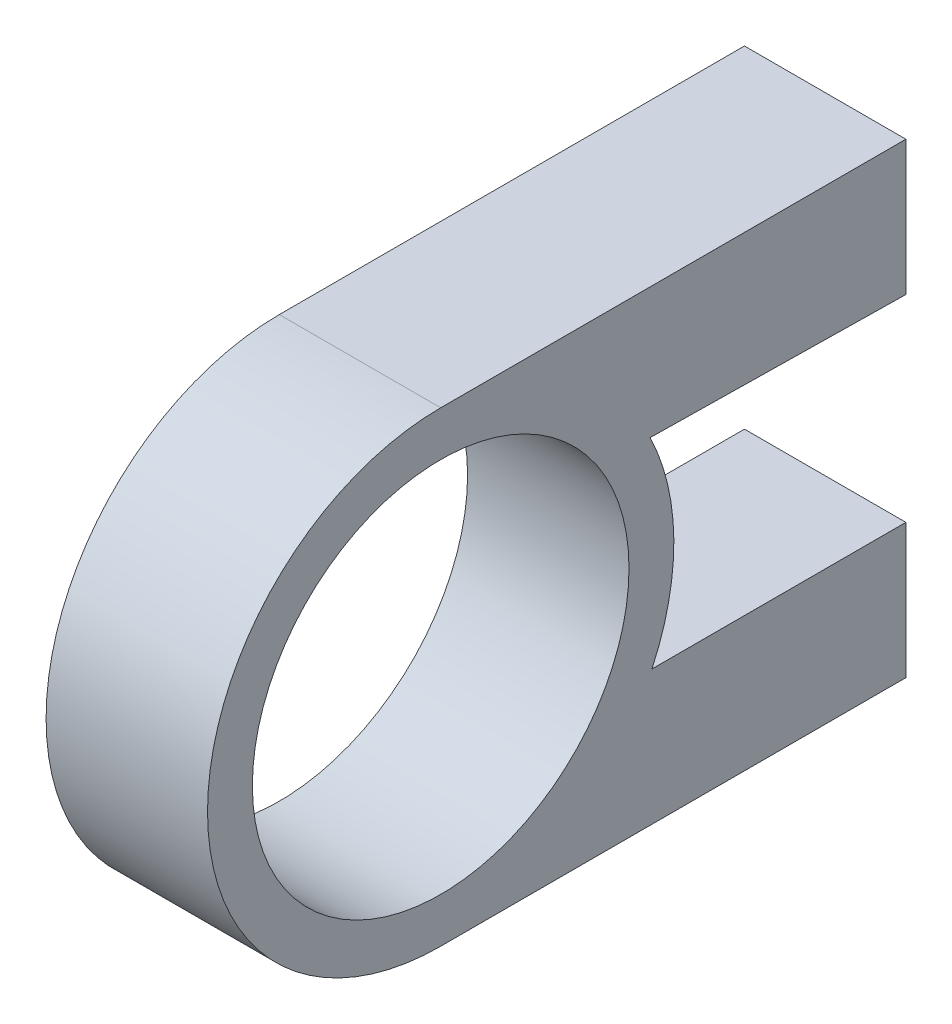
ISO-10303-21;
HEADER;
FILE_DESCRIPTION(('STEP AP214'),'2;1');
FILE_NAME('part.step','',(''),(''),'','','');
FILE_SCHEMA(('AUTOMOTIVE_DESIGN { 1 0 10303 214 1 1 1 1 }'));
ENDSEC;
DATA;
#1=APPLICATION_CONTEXT('core data for automotive mechanical design processes');
#2=APPLICATION_PROTOCOL_DEFINITION('international standard','automotive_design',2000,#1);
#3=PRODUCT_CONTEXT('',#1,'mechanical');
#4=PRODUCT('Part','Part','',(#3));
#5=PRODUCT_RELATED_PRODUCT_CATEGORY('part','',(#4));
#6=PRODUCT_DEFINITION_FORMATION('','',#4);
#7=PRODUCT_DEFINITION_CONTEXT('part definition',#1,'design');
#8=PRODUCT_DEFINITION('design','',#6,#7);
#9=PRODUCT_DEFINITION_SHAPE('','',#8);
#10=(LENGTH_UNIT() NAMED_UNIT(*) SI_UNIT(.MILLI.,.METRE.));
#11=(NAMED_UNIT(*) PLANE_ANGLE_UNIT() SI_UNIT($,.RADIAN.));
#12=(NAMED_UNIT(*) SI_UNIT($,.STERADIAN.) SOLID_ANGLE_UNIT());
#13=UNCERTAINTY_MEASURE_WITH_UNIT(LENGTH_MEASURE(1.E-05),#10,'distance_accuracy_value','');
#14=(GEOMETRIC_REPRESENTATION_CONTEXT(3) GLOBAL_UNCERTAINTY_ASSIGNED_CONTEXT((#13)) GLOBAL_UNIT_ASSIGNED_CONTEXT((#10,
#11,#12)) REPRESENTATION_CONTEXT('',''));
#15=CARTESIAN_POINT('',(0.,0.,0.));
#16=DIRECTION('',(0.,0.,1.));
#17=DIRECTION('',(1.,0.,0.));
#18=AXIS2_PLACEMENT_3D('',#15,#16,#17);
#19=CARTESIAN_POINT('',(1.8,2.6,0.));
#20=DIRECTION('',(0.,1.,0.));
#21=DIRECTION('',(0.,0.,1.));
#22=AXIS2_PLACEMENT_3D('',#19,#20,#21);
#23=PLANE('',#22);
#24=DIRECTION('',(0.,0.,-1.));
#25=VECTOR('',#24,1.);
#26=CARTESIAN_POINT('',(0.,2.6,0.));
#27=LINE('',#26,#25);
#28=CARTESIAN_POINT('',(0.,2.6,0.));
#29=VERTEX_POINT('',#28);
#30=CARTESIAN_POINT('',(0.,2.6,-5.1875));
#31=VERTEX_POINT('',#30);
#32=EDGE_CURVE('E173',#29,#31,#27,.T.);
#33=ORIENTED_EDGE('',*,*,#32,.F.);
#34=DIRECTION('',(-1.,0.,0.));
#35=VECTOR('',#34,1.);
#36=CARTESIAN_POINT('',(1.8,2.6,0.));
#37=LINE('',#36,#35);
#38=CARTESIAN_POINT('',(1.8,2.6,0.));
#39=VERTEX_POINT('',#38);
#40=EDGE_CURVE('E11',#39,#29,#37,.T.);
#41=ORIENTED_EDGE('',*,*,#40,.F.);
#42=DIRECTION('',(0.,0.,-1.));
#43=VECTOR('',#42,1.);
#44=CARTESIAN_POINT('',(1.8,2.6,0.));
#45=LINE('',#44,#43);
#46=CARTESIAN_POINT('',(1.8,2.6,-5.1875));
#47=VERTEX_POINT('',#46);
#48=EDGE_CURVE('E243',#39,#47,#45,.T.);
#49=ORIENTED_EDGE('',*,*,#48,.T.);
#50=DIRECTION('',(-1.,0.,0.));
#51=VECTOR('',#50,1.);
#52=CARTESIAN_POINT('',(1.8,2.6,-5.1875));
#53=LINE('',#52,#51);
#54=EDGE_CURVE('E99',#47,#31,#53,.T.);
#55=ORIENTED_EDGE('',*,*,#54,.T.);
#56=EDGE_LOOP('',(#33,#41,#49,#55));
#57=FACE_BOUND('',#56,.T.);
#58=ADVANCED_FACE('F47',(#57),#23,.T.);
#59=CARTESIAN_POINT('',(1.8,0.,0.));
#60=DIRECTION('',(-1.,0.,0.));
#61=DIRECTION('',(0.,0.,1.));
#62=AXIS2_PLACEMENT_3D('',#59,#60,#61);
#63=CYLINDRICAL_SURFACE('',#62,2.6);
#64=CARTESIAN_POINT('',(0.,0.,0.));
#65=DIRECTION('',(1.,0.,0.));
#66=DIRECTION('',(0.,0.,-1.));
#67=AXIS2_PLACEMENT_3D('',#64,#65,#66);
#68=CIRCLE('',#67,2.6);
#69=CARTESIAN_POINT('',(0.,-2.6,0.));
#70=VERTEX_POINT('',#69);
#71=EDGE_CURVE('E170',#29,#70,#68,.T.);
#72=ORIENTED_EDGE('',*,*,#71,.T.);
#73=DIRECTION('',(-1.,0.,0.));
#74=VECTOR('',#73,1.);
#75=CARTESIAN_POINT('',(1.8,-2.6,0.));
#76=LINE('',#75,#74);
#77=CARTESIAN_POINT('',(1.8,-2.6,0.));
#78=VERTEX_POINT('',#77);
#79=EDGE_CURVE('E57',#78,#70,#76,.T.);
#80=ORIENTED_EDGE('',*,*,#79,.F.);
#81=CARTESIAN_POINT('',(1.8,0.,0.));
#82=DIRECTION('',(1.,0.,0.));
#83=DIRECTION('',(0.,0.,-1.));
#84=AXIS2_PLACEMENT_3D('',#81,#82,#83);
#85=CIRCLE('',#84,2.6);
#86=EDGE_CURVE('E246',#39,#78,#85,.T.);
#87=ORIENTED_EDGE('',*,*,#86,.F.);
#88=ORIENTED_EDGE('',*,*,#40,.T.);
#89=EDGE_LOOP('',(#72,#80,#87,#88));
#90=FACE_BOUND('',#89,.T.);
#91=ADVANCED_FACE('F171',(#90),#63,.T.);
#92=CARTESIAN_POINT('',(1.8,-2.6,0.));
#93=DIRECTION('',(0.,1.,0.));
#94=DIRECTION('',(0.,0.,1.));
#95=AXIS2_PLACEMENT_3D('',#92,#93,#94);
#96=PLANE('',#95);
#97=DIRECTION('',(0.,0.,-1.));
#98=VECTOR('',#97,1.);
#99=CARTESIAN_POINT('',(0.,-2.6,0.));
#100=LINE('',#99,#98);
#101=CARTESIAN_POINT('',(0.,-2.6,-5.1875));
#102=VERTEX_POINT('',#101);
#103=EDGE_CURVE('E164',#70,#102,#100,.T.);
#104=ORIENTED_EDGE('',*,*,#103,.T.);
#105=DIRECTION('',(-1.,0.,0.));
#106=VECTOR('',#105,1.);
#107=CARTESIAN_POINT('',(1.8,-2.6,-5.1875));
#108=LINE('',#107,#106);
#109=CARTESIAN_POINT('',(1.8,-2.6,-5.1875));
#110=VERTEX_POINT('',#109);
#111=EDGE_CURVE('E153',#110,#102,#108,.T.);
#112=ORIENTED_EDGE('',*,*,#111,.F.);
#113=DIRECTION('',(0.,0.,-1.));
#114=VECTOR('',#113,1.);
#115=CARTESIAN_POINT('',(1.8,-2.6,0.));
#116=LINE('',#115,#114);
#117=EDGE_CURVE('E166',#78,#110,#116,.T.);
#118=ORIENTED_EDGE('',*,*,#117,.F.);
#119=ORIENTED_EDGE('',*,*,#79,.T.);
#120=EDGE_LOOP('',(#104,#112,#118,#119));
#121=FACE_BOUND('',#120,.T.);
#122=ADVANCED_FACE('F162',(#121),#96,.F.);
#123=CARTESIAN_POINT('',(1.8,0.,-5.1875));
#124=DIRECTION('',(0.,0.,1.));
#125=DIRECTION('',(1.,0.,0.));
#126=AXIS2_PLACEMENT_3D('',#123,#124,#125);
#127=PLANE('',#126);
#128=DIRECTION('',(0.,1.,0.));
#129=VECTOR('',#128,1.);
#130=CARTESIAN_POINT('',(0.,0.,-5.1875));
#131=LINE('',#130,#129);
#132=CARTESIAN_POINT('',(0.,-1.1,-5.1875));
#133=VERTEX_POINT('',#132);
#134=EDGE_CURVE('E177',#102,#133,#131,.T.);
#135=ORIENTED_EDGE('',*,*,#134,.T.);
#136=DIRECTION('',(-1.,0.,0.));
#137=VECTOR('',#136,1.);
#138=CARTESIAN_POINT('',(1.8,-1.1,-5.1875));
#139=LINE('',#138,#137);
#140=CARTESIAN_POINT('',(1.8,-1.1,-5.1875));
#141=VERTEX_POINT('',#140);
#142=EDGE_CURVE('E146',#141,#133,#139,.T.);
#143=ORIENTED_EDGE('',*,*,#142,.F.);
#144=DIRECTION('',(0.,1.,0.));
#145=VECTOR('',#144,1.);
#146=CARTESIAN_POINT('',(1.8,0.,-5.1875));
#147=LINE('',#146,#145);
#148=EDGE_CURVE('E253',#110,#141,#147,.T.);
#149=ORIENTED_EDGE('',*,*,#148,.F.);
#150=ORIENTED_EDGE('',*,*,#111,.T.);
#151=EDGE_LOOP('',(#135,#143,#149,#150));
#152=FACE_BOUND('',#151,.T.);
#153=ADVANCED_FACE('F225',(#152),#127,.F.);
#154=CARTESIAN_POINT('',(1.8,-1.1,0.));
#155=DIRECTION('',(0.,1.,0.));
#156=DIRECTION('',(0.,0.,1.));
#157=AXIS2_PLACEMENT_3D('',#154,#155,#156);
#158=PLANE('',#157);
#159=DIRECTION('',(0.,0.,-1.));
#160=VECTOR('',#159,1.);
#161=CARTESIAN_POINT('',(0.,-1.1,0.));
#162=LINE('',#161,#160);
#163=CARTESIAN_POINT('',(0.,-1.1,-2.35584379787795));
#164=VERTEX_POINT('',#163);
#165=EDGE_CURVE('E186',#164,#133,#162,.T.);
#166=ORIENTED_EDGE('',*,*,#165,.F.);
#167=DIRECTION('',(-1.,0.,0.));
#168=VECTOR('',#167,1.);
#169=CARTESIAN_POINT('',(1.8,-1.1,-2.35584379787795));
#170=LINE('',#169,#168);
#171=CARTESIAN_POINT('',(1.8,-1.1,-2.35584379787795));
#172=VERTEX_POINT('',#171);
#173=EDGE_CURVE('E142',#172,#164,#170,.T.);
#174=ORIENTED_EDGE('',*,*,#173,.F.);
#175=DIRECTION('',(0.,0.,-1.));
#176=VECTOR('',#175,1.);
#177=CARTESIAN_POINT('',(1.8,-1.1,0.));
#178=LINE('',#177,#176);
#179=EDGE_CURVE('E134',#172,#141,#178,.T.);
#180=ORIENTED_EDGE('',*,*,#179,.T.);
#181=ORIENTED_EDGE('',*,*,#142,.T.);
#182=EDGE_LOOP('',(#166,#174,#180,#181));
#183=FACE_BOUND('',#182,.T.);
#184=ADVANCED_FACE('F228',(#183),#158,.T.);
#185=CARTESIAN_POINT('',(1.8,0.,0.));
#186=DIRECTION('',(-1.,0.,0.));
#187=DIRECTION('',(0.,0.,1.));
#188=AXIS2_PLACEMENT_3D('',#185,#186,#187);
#189=CYLINDRICAL_SURFACE('',#188,2.6);
#190=CARTESIAN_POINT('',(0.,0.,0.));
#191=DIRECTION('',(1.,0.,0.));
#192=DIRECTION('',(0.,0.,-1.));
#193=AXIS2_PLACEMENT_3D('',#190,#191,#192);
#194=CIRCLE('',#193,2.6);
#195=CARTESIAN_POINT('',(0.,1.144,-2.33479420934694));
#196=VERTEX_POINT('',#195);
#197=EDGE_CURVE('E140',#164,#196,#194,.T.);
#198=ORIENTED_EDGE('',*,*,#197,.T.);
#199=DIRECTION('',(-1.,0.,0.));
#200=VECTOR('',#199,1.);
#201=CARTESIAN_POINT('',(1.8,1.144,-2.33479420934694));
#202=LINE('',#201,#200);
#203=CARTESIAN_POINT('',(1.8,1.144,-2.33479420934694));
#204=VERTEX_POINT('',#203);
#205=EDGE_CURVE('E124',#204,#196,#202,.T.);
#206=ORIENTED_EDGE('',*,*,#205,.F.);
#207=CARTESIAN_POINT('',(1.8,0.,0.));
#208=DIRECTION('',(1.,0.,0.));
#209=DIRECTION('',(0.,0.,-1.));
#210=AXIS2_PLACEMENT_3D('',#207,#208,#209);
#211=CIRCLE('',#210,2.6);
#212=EDGE_CURVE('E128',#172,#204,#211,.T.);
#213=ORIENTED_EDGE('',*,*,#212,.F.);
#214=ORIENTED_EDGE('',*,*,#173,.T.);
#215=EDGE_LOOP('',(#198,#206,#213,#214));
#216=FACE_BOUND('',#215,.T.);
#217=ADVANCED_FACE('F138',(#216),#189,.T.);
#218=CARTESIAN_POINT('',(1.8,1.17973110006513,-0.0181961170243854));
#219=DIRECTION('',(0.,0.99988107205628,-0.0154221186477153));
#220=DIRECTION('',(0.,0.0154221186477153,0.99988107205628));
#221=AXIS2_PLACEMENT_3D('',#218,#219,#220);
#222=PLANE('',#221);
#223=DIRECTION('',(0.,-0.0154221186477153,-0.99988107205628));
#224=VECTOR('',#223,1.);
#225=CARTESIAN_POINT('',(0.,1.17973110006513,-0.0181961170243854));
#226=LINE('',#225,#224);
#227=CARTESIAN_POINT('',(0.,1.1,-5.1875));
#228=VERTEX_POINT('',#227);
#229=EDGE_CURVE('E192',#196,#228,#226,.T.);
#230=ORIENTED_EDGE('',*,*,#229,.T.);
#231=DIRECTION('',(-1.,0.,0.));
#232=VECTOR('',#231,1.);
#233=CARTESIAN_POINT('',(1.8,1.1,-5.1875));
#234=LINE('',#233,#232);
#235=CARTESIAN_POINT('',(1.8,1.1,-5.1875));
#236=VERTEX_POINT('',#235);
#237=EDGE_CURVE('E126',#236,#228,#234,.T.);
#238=ORIENTED_EDGE('',*,*,#237,.F.);
#239=DIRECTION('',(0.,-0.0154221186477153,-0.99988107205628));
#240=VECTOR('',#239,1.);
#241=CARTESIAN_POINT('',(1.8,1.17973110006513,-0.0181961170243854));
#242=LINE('',#241,#240);
#243=EDGE_CURVE('E119',#204,#236,#242,.T.);
#244=ORIENTED_EDGE('',*,*,#243,.F.);
#245=ORIENTED_EDGE('',*,*,#205,.T.);
#246=EDGE_LOOP('',(#230,#238,#244,#245));
#247=FACE_BOUND('',#246,.T.);
#248=ADVANCED_FACE('F122',(#247),#222,.F.);
#249=CARTESIAN_POINT('',(1.8,0.,0.));
#250=DIRECTION('',(-1.,0.,0.));
#251=DIRECTION('',(0.,0.,1.));
#252=AXIS2_PLACEMENT_3D('',#249,#250,#251);
#253=CYLINDRICAL_SURFACE('',#252,2.1);
#254=CARTESIAN_POINT('',(1.8,0.,0.));
#255=DIRECTION('',(1.,0.,0.));
#256=DIRECTION('',(0.,0.,-1.));
#257=AXIS2_PLACEMENT_3D('',#254,#255,#256);
#258=CIRCLE('',#257,2.1);
#259=CARTESIAN_POINT('',(1.8,0.,-2.1));
#260=VERTEX_POINT('',#259);
#261=EDGE_CURVE('E196',#260,#260,#258,.T.);
#262=ORIENTED_EDGE('',*,*,#261,.T.);
#263=EDGE_LOOP('',(#262));
#264=FACE_BOUND('',#263,.T.);
#265=CARTESIAN_POINT('',(0.,0.,0.));
#266=DIRECTION('',(1.,0.,0.));
#267=DIRECTION('',(0.,0.,-1.));
#268=AXIS2_PLACEMENT_3D('',#265,#266,#267);
#269=CIRCLE('',#268,2.1);
#270=CARTESIAN_POINT('',(0.,0.,-2.1));
#271=VERTEX_POINT('',#270);
#272=EDGE_CURVE('E179',#271,#271,#269,.T.);
#273=ORIENTED_EDGE('',*,*,#272,.F.);
#274=EDGE_LOOP('',(#273));
#275=FACE_BOUND('',#274,.T.);
#276=ADVANCED_FACE('F49',(#264,#275),#253,.F.);
#277=CARTESIAN_POINT('',(1.8,0.,-5.1875));
#278=DIRECTION('',(0.,0.,1.));
#279=DIRECTION('',(1.,0.,0.));
#280=AXIS2_PLACEMENT_3D('',#277,#278,#279);
#281=PLANE('',#280);
#282=DIRECTION('',(0.,1.,0.));
#283=VECTOR('',#282,1.);
#284=CARTESIAN_POINT('',(0.,0.,-5.1875));
#285=LINE('',#284,#283);
#286=EDGE_CURVE('E92',#228,#31,#285,.T.);
#287=ORIENTED_EDGE('',*,*,#286,.T.);
#288=ORIENTED_EDGE('',*,*,#54,.F.);
#289=DIRECTION('',(0.,1.,0.));
#290=VECTOR('',#289,1.);
#291=CARTESIAN_POINT('',(1.8,0.,-5.1875));
#292=LINE('',#291,#290);
#293=EDGE_CURVE('E65',#236,#47,#292,.T.);
#294=ORIENTED_EDGE('',*,*,#293,.F.);
#295=ORIENTED_EDGE('',*,*,#237,.T.);
#296=EDGE_LOOP('',(#287,#288,#294,#295));
#297=FACE_BOUND('',#296,.T.);
#298=ADVANCED_FACE('F207',(#297),#281,.F.);
#299=CARTESIAN_POINT('',(1.8,0.,0.));
#300=DIRECTION('',(1.,0.,0.));
#301=DIRECTION('',(0.,0.,-1.));
#302=AXIS2_PLACEMENT_3D('',#299,#300,#301);
#303=PLANE('',#302);
#304=ORIENTED_EDGE('',*,*,#261,.F.);
#305=EDGE_LOOP('',(#304));
#306=FACE_BOUND('',#305,.T.);
#307=ORIENTED_EDGE('',*,*,#48,.F.);
#308=ORIENTED_EDGE('',*,*,#86,.T.);
#309=ORIENTED_EDGE('',*,*,#117,.T.);
#310=ORIENTED_EDGE('',*,*,#148,.T.);
#311=ORIENTED_EDGE('',*,*,#179,.F.);
#312=ORIENTED_EDGE('',*,*,#212,.T.);
#313=ORIENTED_EDGE('',*,*,#243,.T.);
#314=ORIENTED_EDGE('',*,*,#293,.T.);
#315=EDGE_LOOP('',(#307,#308,#309,#310,#311,#312,#313,#314));
#316=FACE_BOUND('',#315,.T.);
#317=ADVANCED_FACE('F132',(#306,#316),#303,.T.);
#318=CARTESIAN_POINT('',(0.,0.,0.));
#319=DIRECTION('',(1.,0.,0.));
#320=DIRECTION('',(0.,0.,-1.));
#321=AXIS2_PLACEMENT_3D('',#318,#319,#320);
#322=PLANE('',#321);
#323=ORIENTED_EDGE('',*,*,#272,.T.);
#324=EDGE_LOOP('',(#323));
#325=FACE_BOUND('',#324,.T.);
#326=ORIENTED_EDGE('',*,*,#32,.T.);
#327=ORIENTED_EDGE('',*,*,#286,.F.);
#328=ORIENTED_EDGE('',*,*,#229,.F.);
#329=ORIENTED_EDGE('',*,*,#197,.F.);
#330=ORIENTED_EDGE('',*,*,#165,.T.);
#331=ORIENTED_EDGE('',*,*,#134,.F.);
#332=ORIENTED_EDGE('',*,*,#103,.F.);
#333=ORIENTED_EDGE('',*,*,#71,.F.);
#334=EDGE_LOOP('',(#326,#327,#328,#329,#330,#331,#332,#333));
#335=FACE_BOUND('',#334,.T.);
#336=ADVANCED_FACE('F204',(#325,#335),#322,.F.);
#337=CLOSED_SHELL('',(#58,#91,#122,#153,#184,#217,#248,#276,#298,#317,#336));
#338=MANIFOLD_SOLID_BREP('B2',#337);
#339=ADVANCED_BREP_SHAPE_REPRESENTATION('',(#18,#338),#14);
#340=SHAPE_DEFINITION_REPRESENTATION(#9,#339);
ENDSEC;
END-ISO-10303-21;
